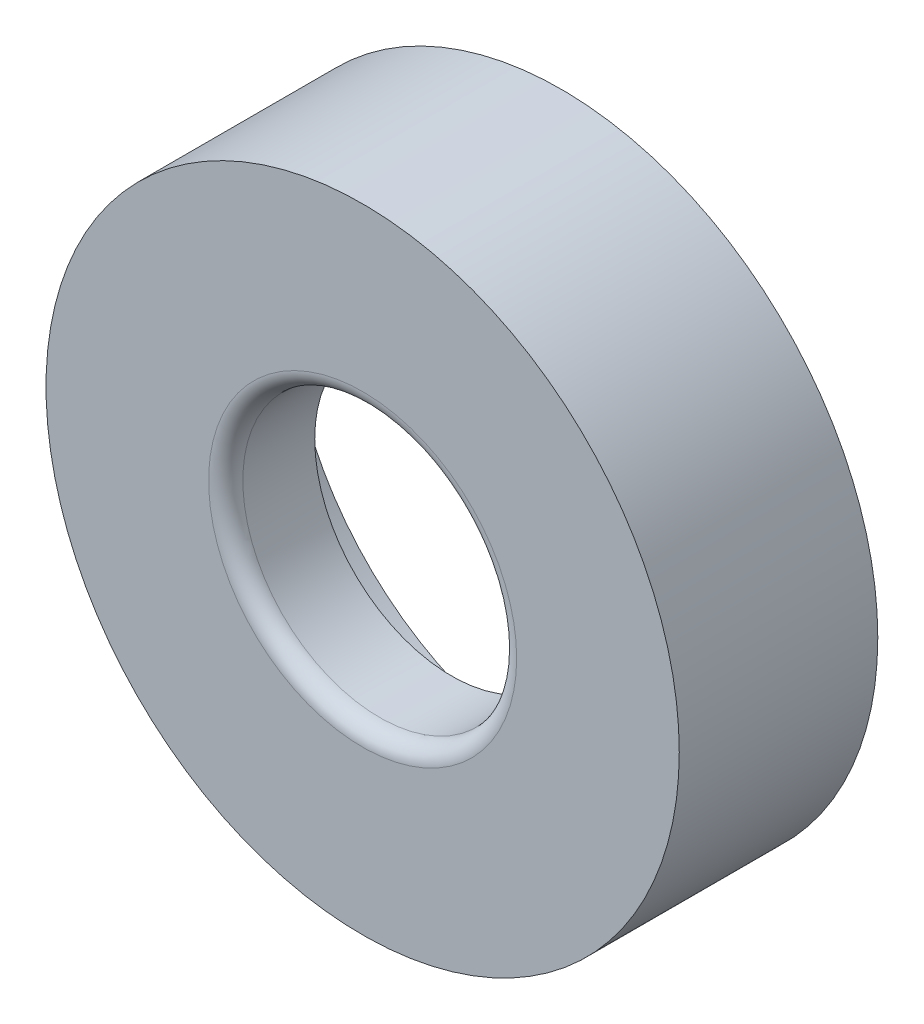
ISO-10303-21;
HEADER;
FILE_DESCRIPTION(('STEP AP214'),'2;1');
FILE_NAME('part.step','',(''),(''),'','','');
FILE_SCHEMA(('AUTOMOTIVE_DESIGN { 1 0 10303 214 1 1 1 1 }'));
ENDSEC;
DATA;
#1=APPLICATION_CONTEXT('core data for automotive mechanical design processes');
#2=APPLICATION_PROTOCOL_DEFINITION('international standard','automotive_design',2000,#1);
#3=PRODUCT_CONTEXT('',#1,'mechanical');
#4=PRODUCT('Part','Part','',(#3));
#5=PRODUCT_RELATED_PRODUCT_CATEGORY('part','',(#4));
#6=PRODUCT_DEFINITION_FORMATION('','',#4);
#7=PRODUCT_DEFINITION_CONTEXT('part definition',#1,'design');
#8=PRODUCT_DEFINITION('design','',#6,#7);
#9=PRODUCT_DEFINITION_SHAPE('','',#8);
#10=(LENGTH_UNIT() NAMED_UNIT(*) SI_UNIT(.MILLI.,.METRE.));
#11=(NAMED_UNIT(*) PLANE_ANGLE_UNIT() SI_UNIT($,.RADIAN.));
#12=(NAMED_UNIT(*) SI_UNIT($,.STERADIAN.) SOLID_ANGLE_UNIT());
#13=UNCERTAINTY_MEASURE_WITH_UNIT(LENGTH_MEASURE(1.E-05),#10,'distance_accuracy_value','');
#14=(GEOMETRIC_REPRESENTATION_CONTEXT(3) GLOBAL_UNCERTAINTY_ASSIGNED_CONTEXT((#13)) GLOBAL_UNIT_ASSIGNED_CONTEXT((#10,
#11,#12)) REPRESENTATION_CONTEXT('',''));
#15=CARTESIAN_POINT('',(0.,0.,0.));
#16=DIRECTION('',(0.,0.,1.));
#17=DIRECTION('',(1.,0.,0.));
#18=AXIS2_PLACEMENT_3D('',#15,#16,#17);
#19=CARTESIAN_POINT('',(85.2065274133614,-1.76399781545092,0.));
#20=DIRECTION('',(0.,0.,1.));
#21=DIRECTION('',(1.,0.,0.));
#22=AXIS2_PLACEMENT_3D('',#19,#20,#21);
#23=CYLINDRICAL_SURFACE('',#22,4.00000000000001);
#24=CARTESIAN_POINT('',(85.2065274133614,-1.76399781545092,5.3));
#25=DIRECTION('',(0.,0.,1.));
#26=DIRECTION('',(1.,0.,0.));
#27=AXIS2_PLACEMENT_3D('',#24,#25,#26);
#28=CIRCLE('',#27,4.00000000000001);
#29=CARTESIAN_POINT('',(89.2065274133614,-1.76399781545092,5.3));
#30=VERTEX_POINT('',#29);
#31=EDGE_CURVE('E41',#30,#30,#28,.T.);
#32=ORIENTED_EDGE('',*,*,#31,.T.);
#33=EDGE_LOOP('',(#32));
#34=FACE_BOUND('',#33,.T.);
#35=CARTESIAN_POINT('',(85.2065274133614,-1.76399781545092,3.2));
#36=DIRECTION('',(0.,0.,-1.));
#37=DIRECTION('',(-1.,0.,0.));
#38=AXIS2_PLACEMENT_3D('',#35,#36,#37);
#39=CIRCLE('',#38,4.00000000000001);
#40=CARTESIAN_POINT('',(81.2065274133614,-1.76399781545092,3.2));
#41=VERTEX_POINT('',#40);
#42=EDGE_CURVE('E52',#41,#41,#39,.F.);
#43=ORIENTED_EDGE('',*,*,#42,.F.);
#44=EDGE_LOOP('',(#43));
#45=FACE_BOUND('',#44,.T.);
#46=ADVANCED_FACE('F34',(#34,#45),#23,.F.);
#47=CARTESIAN_POINT('',(85.2065274133614,-1.76399781545092,5.8));
#48=DIRECTION('',(0.,0.,-1.));
#49=DIRECTION('',(-1.,0.,0.));
#50=AXIS2_PLACEMENT_3D('',#47,#48,#49);
#51=CYLINDRICAL_SURFACE('',#50,9.24999999999999);
#52=CARTESIAN_POINT('',(85.2065274133614,-1.76399781545092,5.8));
#53=DIRECTION('',(0.,0.,1.));
#54=DIRECTION('',(1.,0.,0.));
#55=AXIS2_PLACEMENT_3D('',#52,#53,#54);
#56=CIRCLE('',#55,9.24999999999999);
#57=CARTESIAN_POINT('',(94.4565274133614,-1.76399781545092,5.8));
#58=VERTEX_POINT('',#57);
#59=EDGE_CURVE('E45',#58,#58,#56,.T.);
#60=ORIENTED_EDGE('',*,*,#59,.F.);
#61=EDGE_LOOP('',(#60));
#62=FACE_BOUND('',#61,.T.);
#63=CARTESIAN_POINT('',(85.2065274133614,-1.76399781545092,0.));
#64=DIRECTION('',(0.,0.,1.));
#65=DIRECTION('',(1.,0.,0.));
#66=AXIS2_PLACEMENT_3D('',#63,#64,#65);
#67=CIRCLE('',#66,9.24999999999999);
#68=CARTESIAN_POINT('',(94.4565274133614,-1.76399781545092,0.));
#69=VERTEX_POINT('',#68);
#70=EDGE_CURVE('E49',#69,#69,#67,.T.);
#71=ORIENTED_EDGE('',*,*,#70,.T.);
#72=EDGE_LOOP('',(#71));
#73=FACE_BOUND('',#72,.T.);
#74=ADVANCED_FACE('F80',(#62,#73),#51,.T.);
#75=CARTESIAN_POINT('',(85.2065274133614,-1.76399781545092,5.8));
#76=DIRECTION('',(0.,0.,1.));
#77=DIRECTION('',(1.,0.,0.));
#78=AXIS2_PLACEMENT_3D('',#75,#76,#77);
#79=PLANE('',#78);
#80=CARTESIAN_POINT('',(85.2065274133614,-1.76399781545092,5.8));
#81=DIRECTION('',(0.,0.,1.));
#82=DIRECTION('',(1.,0.,0.));
#83=AXIS2_PLACEMENT_3D('',#80,#81,#82);
#84=CIRCLE('',#83,4.50000000000001);
#85=CARTESIAN_POINT('',(89.7065274133614,-1.76399781545092,5.8));
#86=VERTEX_POINT('',#85);
#87=EDGE_CURVE('E10',#86,#86,#84,.F.);
#88=ORIENTED_EDGE('',*,*,#87,.T.);
#89=EDGE_LOOP('',(#88));
#90=FACE_BOUND('',#89,.T.);
#91=ORIENTED_EDGE('',*,*,#59,.T.);
#92=EDGE_LOOP('',(#91));
#93=FACE_BOUND('',#92,.T.);
#94=ADVANCED_FACE('F76',(#90,#93),#79,.T.);
#95=CARTESIAN_POINT('',(85.2065274133614,-1.76399781545092,0.));
#96=DIRECTION('',(0.,0.,1.));
#97=DIRECTION('',(1.,0.,0.));
#98=AXIS2_PLACEMENT_3D('',#95,#96,#97);
#99=PLANE('',#98);
#100=CARTESIAN_POINT('',(85.2065274133614,-1.76399781545092,0.));
#101=DIRECTION('',(0.,0.,-1.));
#102=DIRECTION('',(-1.,0.,0.));
#103=AXIS2_PLACEMENT_3D('',#100,#101,#102);
#104=CIRCLE('',#103,7.95);
#105=CARTESIAN_POINT('',(77.2565274133614,-1.76399781545092,0.));
#106=VERTEX_POINT('',#105);
#107=EDGE_CURVE('E58',#106,#106,#104,.T.);
#108=ORIENTED_EDGE('',*,*,#107,.F.);
#109=EDGE_LOOP('',(#108));
#110=FACE_BOUND('',#109,.T.);
#111=ORIENTED_EDGE('',*,*,#70,.F.);
#112=EDGE_LOOP('',(#111));
#113=FACE_BOUND('',#112,.T.);
#114=ADVANCED_FACE('F73',(#110,#113),#99,.F.);
#115=CARTESIAN_POINT('',(85.2065274133614,-1.76399781545092,3.2));
#116=DIRECTION('',(0.,0.,-1.));
#117=DIRECTION('',(-1.,0.,0.));
#118=AXIS2_PLACEMENT_3D('',#115,#116,#117);
#119=PLANE('',#118);
#120=CARTESIAN_POINT('',(85.2065274133614,-1.76399781545092,3.2));
#121=DIRECTION('',(0.,0.,-1.));
#122=DIRECTION('',(-1.,0.,0.));
#123=AXIS2_PLACEMENT_3D('',#120,#121,#122);
#124=CIRCLE('',#123,7.95);
#125=CARTESIAN_POINT('',(77.2565274133614,-1.76399781545092,3.2));
#126=VERTEX_POINT('',#125);
#127=EDGE_CURVE('E55',#126,#126,#124,.T.);
#128=ORIENTED_EDGE('',*,*,#127,.T.);
#129=EDGE_LOOP('',(#128));
#130=FACE_BOUND('',#129,.T.);
#131=ORIENTED_EDGE('',*,*,#42,.T.);
#132=EDGE_LOOP('',(#131));
#133=FACE_BOUND('',#132,.T.);
#134=ADVANCED_FACE('F64',(#130,#133),#119,.T.);
#135=CARTESIAN_POINT('',(85.2065274133614,-1.76399781545092,3.2));
#136=DIRECTION('',(0.,0.,-1.));
#137=DIRECTION('',(-1.,0.,0.));
#138=AXIS2_PLACEMENT_3D('',#135,#136,#137);
#139=CYLINDRICAL_SURFACE('',#138,7.95);
#140=ORIENTED_EDGE('',*,*,#127,.F.);
#141=EDGE_LOOP('',(#140));
#142=FACE_BOUND('',#141,.T.);
#143=ORIENTED_EDGE('',*,*,#107,.T.);
#144=EDGE_LOOP('',(#143));
#145=FACE_BOUND('',#144,.T.);
#146=ADVANCED_FACE('F67',(#142,#145),#139,.F.);
#147=CARTESIAN_POINT('',(85.2065274133614,-1.76399781545092,5.3));
#148=DIRECTION('',(0.,0.,1.));
#149=DIRECTION('',(1.,0.,0.));
#150=AXIS2_PLACEMENT_3D('',#147,#148,#149);
#151=TOROIDAL_SURFACE('',#150,4.50000000000001,0.5);
#152=ORIENTED_EDGE('',*,*,#87,.F.);
#153=EDGE_LOOP('',(#152));
#154=FACE_BOUND('',#153,.T.);
#155=ORIENTED_EDGE('',*,*,#31,.F.);
#156=EDGE_LOOP('',(#155));
#157=FACE_BOUND('',#156,.T.);
#158=ADVANCED_FACE('F36',(#154,#157),#151,.T.);
#159=CLOSED_SHELL('',(#46,#74,#94,#114,#134,#146,#158));
#160=MANIFOLD_SOLID_BREP('B2',#159);
#161=ADVANCED_BREP_SHAPE_REPRESENTATION('',(#18,#160),#14);
#162=SHAPE_DEFINITION_REPRESENTATION(#9,#161);
ENDSEC;
END-ISO-10303-21;
